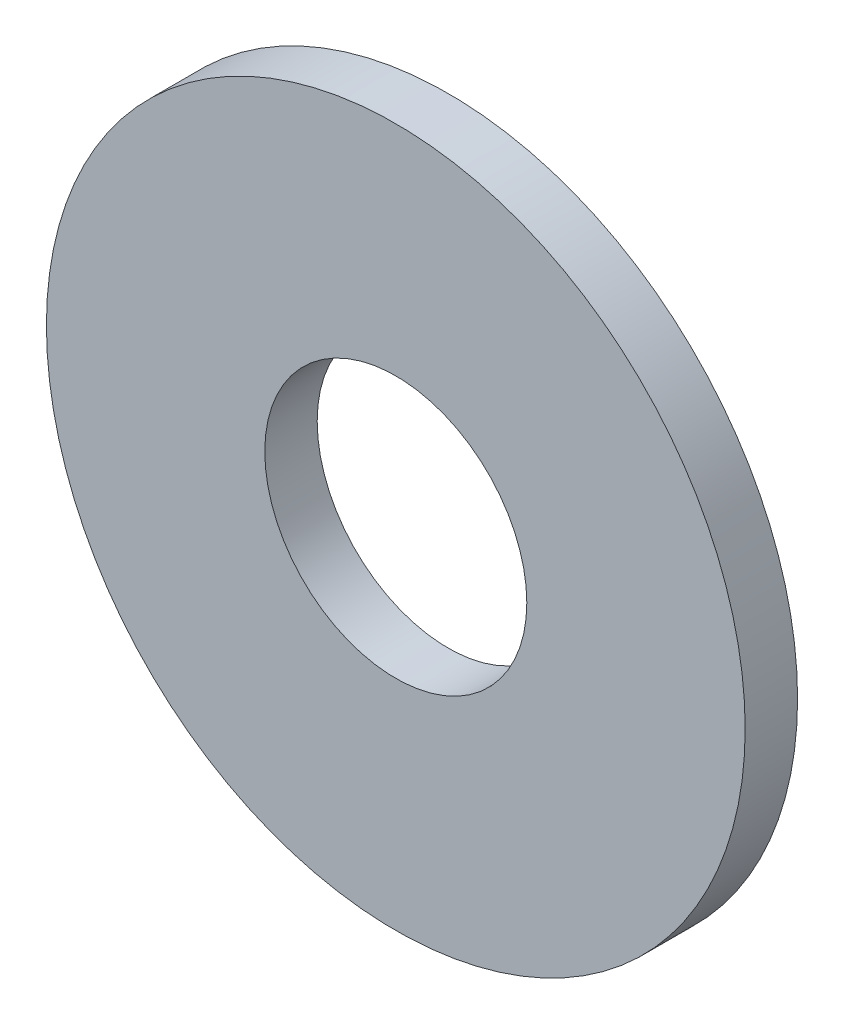
ISO-10303-21;
HEADER;
FILE_DESCRIPTION(('STEP AP214'),'2;1');
FILE_NAME('part.step','',(''),(''),'','','');
FILE_SCHEMA(('AUTOMOTIVE_DESIGN { 1 0 10303 214 1 1 1 1 }'));
ENDSEC;
DATA;
#1=APPLICATION_CONTEXT('core data for automotive mechanical design processes');
#2=APPLICATION_PROTOCOL_DEFINITION('international standard','automotive_design',2000,#1);
#3=PRODUCT_CONTEXT('',#1,'mechanical');
#4=PRODUCT('Part','Part','',(#3));
#5=PRODUCT_RELATED_PRODUCT_CATEGORY('part','',(#4));
#6=PRODUCT_DEFINITION_FORMATION('','',#4);
#7=PRODUCT_DEFINITION_CONTEXT('part definition',#1,'design');
#8=PRODUCT_DEFINITION('design','',#6,#7);
#9=PRODUCT_DEFINITION_SHAPE('','',#8);
#10=(LENGTH_UNIT() NAMED_UNIT(*) SI_UNIT(.MILLI.,.METRE.));
#11=(NAMED_UNIT(*) PLANE_ANGLE_UNIT() SI_UNIT($,.RADIAN.));
#12=(NAMED_UNIT(*) SI_UNIT($,.STERADIAN.) SOLID_ANGLE_UNIT());
#13=UNCERTAINTY_MEASURE_WITH_UNIT(LENGTH_MEASURE(1.E-05),#10,'distance_accuracy_value','');
#14=(GEOMETRIC_REPRESENTATION_CONTEXT(3) GLOBAL_UNCERTAINTY_ASSIGNED_CONTEXT((#13)) GLOBAL_UNIT_ASSIGNED_CONTEXT((#10,
#11,#12)) REPRESENTATION_CONTEXT('',''));
#15=CARTESIAN_POINT('',(0.,0.,0.));
#16=DIRECTION('',(0.,0.,1.));
#17=DIRECTION('',(1.,0.,0.));
#18=AXIS2_PLACEMENT_3D('',#15,#16,#17);
#19=CARTESIAN_POINT('',(0.,0.,0.3));
#20=DIRECTION('',(0.,0.,-1.));
#21=DIRECTION('',(-1.,0.,0.));
#22=AXIS2_PLACEMENT_3D('',#19,#20,#21);
#23=CYLINDRICAL_SURFACE('',#22,2.);
#24=CARTESIAN_POINT('',(0.,0.,0.3));
#25=DIRECTION('',(0.,0.,1.));
#26=DIRECTION('',(1.,0.,0.));
#27=AXIS2_PLACEMENT_3D('',#24,#25,#26);
#28=CIRCLE('',#27,2.);
#29=CARTESIAN_POINT('',(2.,0.,0.3));
#30=VERTEX_POINT('',#29);
#31=EDGE_CURVE('E10',#30,#30,#28,.T.);
#32=ORIENTED_EDGE('',*,*,#31,.F.);
#33=EDGE_LOOP('',(#32));
#34=FACE_BOUND('',#33,.T.);
#35=CARTESIAN_POINT('',(0.,0.,0.));
#36=DIRECTION('',(0.,0.,1.));
#37=DIRECTION('',(1.,0.,0.));
#38=AXIS2_PLACEMENT_3D('',#35,#36,#37);
#39=CIRCLE('',#38,2.);
#40=CARTESIAN_POINT('',(2.,0.,0.));
#41=VERTEX_POINT('',#40);
#42=EDGE_CURVE('E32',#41,#41,#39,.T.);
#43=ORIENTED_EDGE('',*,*,#42,.T.);
#44=EDGE_LOOP('',(#43));
#45=FACE_BOUND('',#44,.T.);
#46=ADVANCED_FACE('F29',(#34,#45),#23,.T.);
#47=CARTESIAN_POINT('',(0.,0.,0.3));
#48=DIRECTION('',(0.,0.,1.));
#49=DIRECTION('',(1.,0.,0.));
#50=AXIS2_PLACEMENT_3D('',#47,#48,#49);
#51=PLANE('',#50);
#52=CARTESIAN_POINT('',(0.,0.,0.3));
#53=DIRECTION('',(0.,0.,1.));
#54=DIRECTION('',(1.,0.,0.));
#55=AXIS2_PLACEMENT_3D('',#52,#53,#54);
#56=CIRCLE('',#55,0.75);
#57=CARTESIAN_POINT('',(0.75,0.,0.3));
#58=VERTEX_POINT('',#57);
#59=EDGE_CURVE('E41',#58,#58,#56,.T.);
#60=ORIENTED_EDGE('',*,*,#59,.F.);
#61=EDGE_LOOP('',(#60));
#62=FACE_BOUND('',#61,.T.);
#63=ORIENTED_EDGE('',*,*,#31,.T.);
#64=EDGE_LOOP('',(#63));
#65=FACE_BOUND('',#64,.T.);
#66=ADVANCED_FACE('F56',(#62,#65),#51,.T.);
#67=CARTESIAN_POINT('',(0.,0.,0.));
#68=DIRECTION('',(0.,0.,1.));
#69=DIRECTION('',(1.,0.,0.));
#70=AXIS2_PLACEMENT_3D('',#67,#68,#69);
#71=PLANE('',#70);
#72=CARTESIAN_POINT('',(0.,0.,0.));
#73=DIRECTION('',(0.,0.,1.));
#74=DIRECTION('',(1.,0.,0.));
#75=AXIS2_PLACEMENT_3D('',#72,#73,#74);
#76=CIRCLE('',#75,0.75);
#77=CARTESIAN_POINT('',(0.75,0.,0.));
#78=VERTEX_POINT('',#77);
#79=EDGE_CURVE('E39',#78,#78,#76,.T.);
#80=ORIENTED_EDGE('',*,*,#79,.T.);
#81=EDGE_LOOP('',(#80));
#82=FACE_BOUND('',#81,.T.);
#83=ORIENTED_EDGE('',*,*,#42,.F.);
#84=EDGE_LOOP('',(#83));
#85=FACE_BOUND('',#84,.T.);
#86=ADVANCED_FACE('F47',(#82,#85),#71,.F.);
#87=CARTESIAN_POINT('',(0.,0.,0.));
#88=DIRECTION('',(0.,0.,1.));
#89=DIRECTION('',(1.,0.,0.));
#90=AXIS2_PLACEMENT_3D('',#87,#88,#89);
#91=CYLINDRICAL_SURFACE('',#90,0.75);
#92=ORIENTED_EDGE('',*,*,#79,.F.);
#93=EDGE_LOOP('',(#92));
#94=FACE_BOUND('',#93,.T.);
#95=ORIENTED_EDGE('',*,*,#59,.T.);
#96=EDGE_LOOP('',(#95));
#97=FACE_BOUND('',#96,.T.);
#98=ADVANCED_FACE('F50',(#94,#97),#91,.F.);
#99=CLOSED_SHELL('',(#46,#66,#86,#98));
#100=MANIFOLD_SOLID_BREP('B2',#99);
#101=ADVANCED_BREP_SHAPE_REPRESENTATION('',(#18,#100),#14);
#102=SHAPE_DEFINITION_REPRESENTATION(#9,#101);
ENDSEC;
END-ISO-10303-21;
